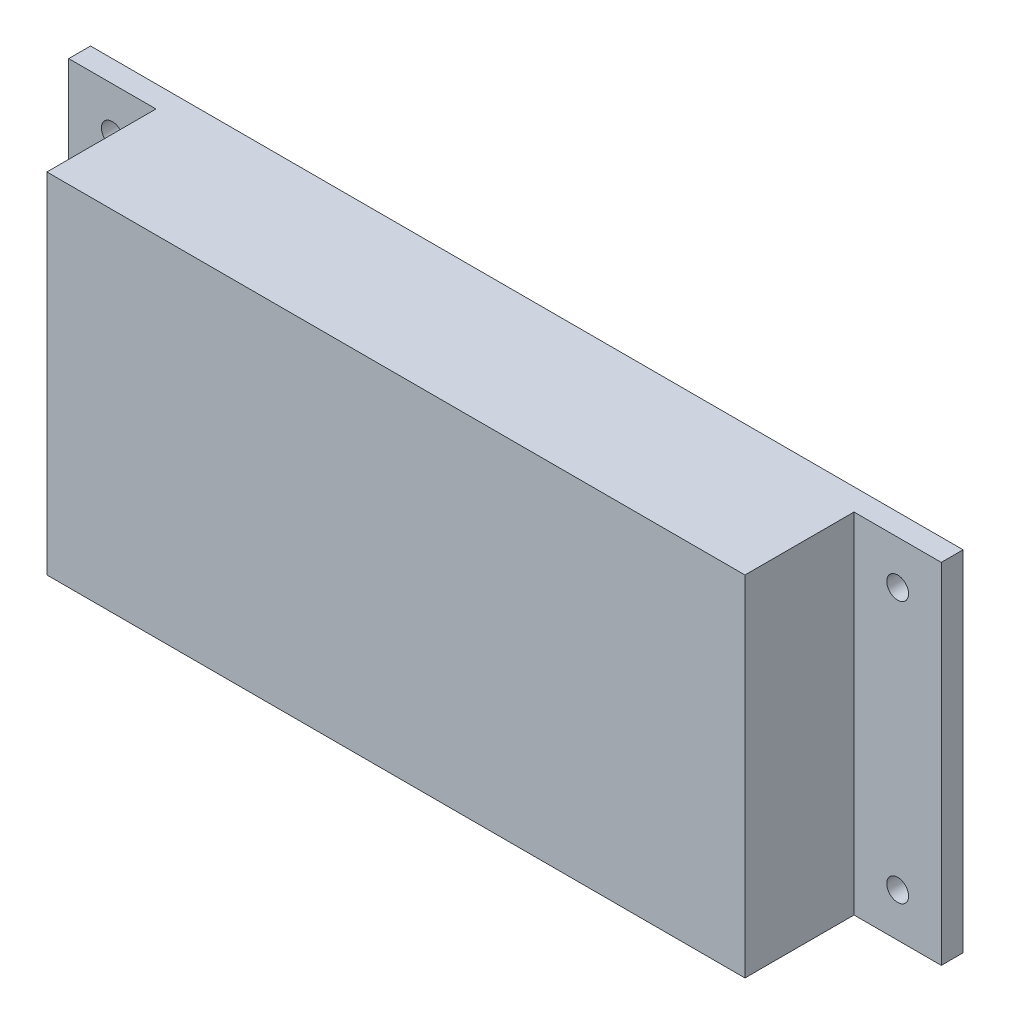
ISO-10303-21;
HEADER;
FILE_DESCRIPTION(('STEP AP214'),'2;1');
FILE_NAME('part.step','',(''),(''),'','','');
FILE_SCHEMA(('AUTOMOTIVE_DESIGN { 1 0 10303 214 1 1 1 1 }'));
ENDSEC;
DATA;
#1=APPLICATION_CONTEXT('core data for automotive mechanical design processes');
#2=APPLICATION_PROTOCOL_DEFINITION('international standard','automotive_design',2000,#1);
#3=PRODUCT_CONTEXT('',#1,'mechanical');
#4=PRODUCT('Part','Part','',(#3));
#5=PRODUCT_RELATED_PRODUCT_CATEGORY('part','',(#4));
#6=PRODUCT_DEFINITION_FORMATION('','',#4);
#7=PRODUCT_DEFINITION_CONTEXT('part definition',#1,'design');
#8=PRODUCT_DEFINITION('design','',#6,#7);
#9=PRODUCT_DEFINITION_SHAPE('','',#8);
#10=(LENGTH_UNIT() NAMED_UNIT(*) SI_UNIT(.MILLI.,.METRE.));
#11=(NAMED_UNIT(*) PLANE_ANGLE_UNIT() SI_UNIT($,.RADIAN.));
#12=(NAMED_UNIT(*) SI_UNIT($,.STERADIAN.) SOLID_ANGLE_UNIT());
#13=UNCERTAINTY_MEASURE_WITH_UNIT(LENGTH_MEASURE(1.E-05),#10,'distance_accuracy_value','');
#14=(GEOMETRIC_REPRESENTATION_CONTEXT(3) GLOBAL_UNCERTAINTY_ASSIGNED_CONTEXT((#13)) GLOBAL_UNIT_ASSIGNED_CONTEXT((#10,
#11,#12)) REPRESENTATION_CONTEXT('',''));
#15=CARTESIAN_POINT('',(0.,0.,0.));
#16=DIRECTION('',(0.,0.,1.));
#17=DIRECTION('',(1.,0.,0.));
#18=AXIS2_PLACEMENT_3D('',#15,#16,#17);
#19=CARTESIAN_POINT('',(0.,0.,5.));
#20=DIRECTION('',(0.,0.,-1.));
#21=DIRECTION('',(-1.,0.,0.));
#22=AXIS2_PLACEMENT_3D('',#19,#20,#21);
#23=PLANE('',#22);
#24=CARTESIAN_POINT('',(90.,30.,5.));
#25=DIRECTION('',(0.,0.,1.));
#26=DIRECTION('',(1.,0.,0.));
#27=AXIS2_PLACEMENT_3D('',#24,#25,#26);
#28=CIRCLE('',#27,2.49999999999999);
#29=CARTESIAN_POINT('',(92.5,30.,5.));
#30=VERTEX_POINT('',#29);
#31=EDGE_CURVE('E232',#30,#30,#28,.T.);
#32=ORIENTED_EDGE('',*,*,#31,.F.);
#33=EDGE_LOOP('',(#32));
#34=FACE_BOUND('',#33,.T.);
#35=CARTESIAN_POINT('',(90.,-30.,5.));
#36=DIRECTION('',(0.,0.,1.));
#37=DIRECTION('',(1.,0.,0.));
#38=AXIS2_PLACEMENT_3D('',#35,#36,#37);
#39=CIRCLE('',#38,2.49999999999999);
#40=CARTESIAN_POINT('',(92.5,-30.,5.));
#41=VERTEX_POINT('',#40);
#42=EDGE_CURVE('E231',#41,#41,#39,.T.);
#43=ORIENTED_EDGE('',*,*,#42,.F.);
#44=EDGE_LOOP('',(#43));
#45=FACE_BOUND('',#44,.T.);
#46=DIRECTION('',(0.,1.,0.));
#47=VECTOR('',#46,1.);
#48=CARTESIAN_POINT('',(80.,-40.,5.));
#49=LINE('',#48,#47);
#50=CARTESIAN_POINT('',(79.9999999999999,-40.,5.));
#51=VERTEX_POINT('',#50);
#52=CARTESIAN_POINT('',(79.9999999999999,40.,5.));
#53=VERTEX_POINT('',#52);
#54=EDGE_CURVE('E59',#51,#53,#49,.T.);
#55=ORIENTED_EDGE('',*,*,#54,.F.);
#56=DIRECTION('',(1.,0.,0.));
#57=VECTOR('',#56,1.);
#58=CARTESIAN_POINT('',(-100.,-40.,5.));
#59=LINE('',#58,#57);
#60=CARTESIAN_POINT('',(100.,-40.,5.));
#61=VERTEX_POINT('',#60);
#62=EDGE_CURVE('E211',#51,#61,#59,.T.);
#63=ORIENTED_EDGE('',*,*,#62,.T.);
#64=DIRECTION('',(0.,1.,0.));
#65=VECTOR('',#64,1.);
#66=CARTESIAN_POINT('',(100.,-40.,5.));
#67=LINE('',#66,#65);
#68=CARTESIAN_POINT('',(100.,40.,5.));
#69=VERTEX_POINT('',#68);
#70=EDGE_CURVE('E202',#61,#69,#67,.T.);
#71=ORIENTED_EDGE('',*,*,#70,.T.);
#72=DIRECTION('',(-1.,0.,0.));
#73=VECTOR('',#72,1.);
#74=CARTESIAN_POINT('',(-100.,40.,5.));
#75=LINE('',#74,#73);
#76=EDGE_CURVE('E207',#69,#53,#75,.T.);
#77=ORIENTED_EDGE('',*,*,#76,.T.);
#78=EDGE_LOOP('',(#55,#63,#71,#77));
#79=FACE_BOUND('',#78,.T.);
#80=ADVANCED_FACE('F42',(#34,#45,#79),#23,.F.);
#81=CARTESIAN_POINT('',(-90.,30.,5.));
#82=DIRECTION('',(0.,0.,1.));
#83=DIRECTION('',(1.,0.,0.));
#84=AXIS2_PLACEMENT_3D('',#81,#82,#83);
#85=CIRCLE('',#84,2.49999999999999);
#86=CARTESIAN_POINT('',(-87.5,30.,5.));
#87=VERTEX_POINT('',#86);
#88=EDGE_CURVE('E245',#87,#87,#85,.T.);
#89=ORIENTED_EDGE('',*,*,#88,.F.);
#90=EDGE_LOOP('',(#89));
#91=FACE_BOUND('',#90,.T.);
#92=CARTESIAN_POINT('',(-90.,-30.,5.));
#93=DIRECTION('',(0.,0.,1.));
#94=DIRECTION('',(1.,0.,0.));
#95=AXIS2_PLACEMENT_3D('',#92,#93,#94);
#96=CIRCLE('',#95,2.49999999999999);
#97=CARTESIAN_POINT('',(-87.5,-30.,5.));
#98=VERTEX_POINT('',#97);
#99=EDGE_CURVE('E235',#98,#98,#96,.T.);
#100=ORIENTED_EDGE('',*,*,#99,.F.);
#101=EDGE_LOOP('',(#100));
#102=FACE_BOUND('',#101,.T.);
#103=DIRECTION('',(0.,-1.,0.));
#104=VECTOR('',#103,1.);
#105=CARTESIAN_POINT('',(-80.,-40.,5.));
#106=LINE('',#105,#104);
#107=CARTESIAN_POINT('',(-80.,40.,5.));
#108=VERTEX_POINT('',#107);
#109=CARTESIAN_POINT('',(-80.,-40.,5.));
#110=VERTEX_POINT('',#109);
#111=EDGE_CURVE('E67',#108,#110,#106,.T.);
#112=ORIENTED_EDGE('',*,*,#111,.F.);
#113=CARTESIAN_POINT('',(-100.,40.,5.));
#114=VERTEX_POINT('',#113);
#115=EDGE_CURVE('E205',#108,#114,#75,.T.);
#116=ORIENTED_EDGE('',*,*,#115,.T.);
#117=DIRECTION('',(0.,-1.,0.));
#118=VECTOR('',#117,1.);
#119=CARTESIAN_POINT('',(-100.,-40.,5.));
#120=LINE('',#119,#118);
#121=CARTESIAN_POINT('',(-100.,-40.,5.));
#122=VERTEX_POINT('',#121);
#123=EDGE_CURVE('E209',#114,#122,#120,.T.);
#124=ORIENTED_EDGE('',*,*,#123,.T.);
#125=EDGE_CURVE('E212',#122,#110,#59,.T.);
#126=ORIENTED_EDGE('',*,*,#125,.T.);
#127=EDGE_LOOP('',(#112,#116,#124,#126));
#128=FACE_BOUND('',#127,.T.);
#129=ADVANCED_FACE('F282',(#91,#102,#128),#23,.F.);
#130=CARTESIAN_POINT('',(100.,-40.,5.));
#131=DIRECTION('',(-1.,0.,0.));
#132=DIRECTION('',(0.,0.,1.));
#133=AXIS2_PLACEMENT_3D('',#130,#131,#132);
#134=PLANE('',#133);
#135=DIRECTION('',(0.,1.,0.));
#136=VECTOR('',#135,1.);
#137=CARTESIAN_POINT('',(100.,-40.,0.));
#138=LINE('',#137,#136);
#139=CARTESIAN_POINT('',(100.,-40.,0.));
#140=VERTEX_POINT('',#139);
#141=CARTESIAN_POINT('',(100.,40.,0.));
#142=VERTEX_POINT('',#141);
#143=EDGE_CURVE('E201',#140,#142,#138,.T.);
#144=ORIENTED_EDGE('',*,*,#143,.T.);
#145=DIRECTION('',(0.,0.,-1.));
#146=VECTOR('',#145,1.);
#147=CARTESIAN_POINT('',(100.,40.,5.));
#148=LINE('',#147,#146);
#149=EDGE_CURVE('E11',#69,#142,#148,.T.);
#150=ORIENTED_EDGE('',*,*,#149,.F.);
#151=ORIENTED_EDGE('',*,*,#70,.F.);
#152=DIRECTION('',(0.,0.,-1.));
#153=VECTOR('',#152,1.);
#154=CARTESIAN_POINT('',(100.,-40.,5.));
#155=LINE('',#154,#153);
#156=EDGE_CURVE('E214',#61,#140,#155,.T.);
#157=ORIENTED_EDGE('',*,*,#156,.T.);
#158=EDGE_LOOP('',(#144,#150,#151,#157));
#159=FACE_BOUND('',#158,.T.);
#160=ADVANCED_FACE('F44',(#159),#134,.F.);
#161=CARTESIAN_POINT('',(-100.,40.,5.));
#162=DIRECTION('',(0.,-1.,0.));
#163=DIRECTION('',(0.,0.,-1.));
#164=AXIS2_PLACEMENT_3D('',#161,#162,#163);
#165=PLANE('',#164);
#166=DIRECTION('',(-1.,0.,0.));
#167=VECTOR('',#166,1.);
#168=CARTESIAN_POINT('',(-100.,40.,0.));
#169=LINE('',#168,#167);
#170=CARTESIAN_POINT('',(-100.,40.,0.));
#171=VERTEX_POINT('',#170);
#172=EDGE_CURVE('E217',#142,#171,#169,.T.);
#173=ORIENTED_EDGE('',*,*,#172,.T.);
#174=DIRECTION('',(0.,0.,-1.));
#175=VECTOR('',#174,1.);
#176=CARTESIAN_POINT('',(-100.,40.,5.));
#177=LINE('',#176,#175);
#178=EDGE_CURVE('E51',#114,#171,#177,.T.);
#179=ORIENTED_EDGE('',*,*,#178,.F.);
#180=ORIENTED_EDGE('',*,*,#115,.F.);
#181=DIRECTION('',(0.,0.,-1.));
#182=VECTOR('',#181,1.);
#183=CARTESIAN_POINT('',(-80.,40.,30.));
#184=LINE('',#183,#182);
#185=CARTESIAN_POINT('',(-80.,40.,30.));
#186=VERTEX_POINT('',#185);
#187=EDGE_CURVE('E195',#186,#108,#184,.T.);
#188=ORIENTED_EDGE('',*,*,#187,.F.);
#189=DIRECTION('',(-1.,0.,0.));
#190=VECTOR('',#189,1.);
#191=CARTESIAN_POINT('',(-80.,40.,30.));
#192=LINE('',#191,#190);
#193=CARTESIAN_POINT('',(80.,40.,30.));
#194=VERTEX_POINT('',#193);
#195=EDGE_CURVE('E181',#194,#186,#192,.T.);
#196=ORIENTED_EDGE('',*,*,#195,.F.);
#197=DIRECTION('',(0.,0.,-1.));
#198=VECTOR('',#197,1.);
#199=CARTESIAN_POINT('',(80.,40.,30.));
#200=LINE('',#199,#198);
#201=EDGE_CURVE('E198',#194,#53,#200,.T.);
#202=ORIENTED_EDGE('',*,*,#201,.T.);
#203=ORIENTED_EDGE('',*,*,#76,.F.);
#204=ORIENTED_EDGE('',*,*,#149,.T.);
#205=EDGE_LOOP('',(#173,#179,#180,#188,#196,#202,#203,#204));
#206=FACE_BOUND('',#205,.T.);
#207=ADVANCED_FACE('F278',(#206),#165,.F.);
#208=CARTESIAN_POINT('',(-100.,-40.,5.));
#209=DIRECTION('',(1.,0.,0.));
#210=DIRECTION('',(0.,0.,-1.));
#211=AXIS2_PLACEMENT_3D('',#208,#209,#210);
#212=PLANE('',#211);
#213=DIRECTION('',(0.,-1.,0.));
#214=VECTOR('',#213,1.);
#215=CARTESIAN_POINT('',(-100.,-40.,0.));
#216=LINE('',#215,#214);
#217=CARTESIAN_POINT('',(-100.,-40.,0.));
#218=VERTEX_POINT('',#217);
#219=EDGE_CURVE('E219',#171,#218,#216,.T.);
#220=ORIENTED_EDGE('',*,*,#219,.T.);
#221=DIRECTION('',(0.,0.,-1.));
#222=VECTOR('',#221,1.);
#223=CARTESIAN_POINT('',(-100.,-40.,5.));
#224=LINE('',#223,#222);
#225=EDGE_CURVE('E224',#122,#218,#224,.T.);
#226=ORIENTED_EDGE('',*,*,#225,.F.);
#227=ORIENTED_EDGE('',*,*,#123,.F.);
#228=ORIENTED_EDGE('',*,*,#178,.T.);
#229=EDGE_LOOP('',(#220,#226,#227,#228));
#230=FACE_BOUND('',#229,.T.);
#231=ADVANCED_FACE('F275',(#230),#212,.F.);
#232=CARTESIAN_POINT('',(-100.,-40.,5.));
#233=DIRECTION('',(0.,1.,0.));
#234=DIRECTION('',(0.,0.,1.));
#235=AXIS2_PLACEMENT_3D('',#232,#233,#234);
#236=PLANE('',#235);
#237=DIRECTION('',(1.,0.,0.));
#238=VECTOR('',#237,1.);
#239=CARTESIAN_POINT('',(-100.,-40.,0.));
#240=LINE('',#239,#238);
#241=EDGE_CURVE('E206',#218,#140,#240,.T.);
#242=ORIENTED_EDGE('',*,*,#241,.T.);
#243=ORIENTED_EDGE('',*,*,#156,.F.);
#244=ORIENTED_EDGE('',*,*,#62,.F.);
#245=DIRECTION('',(0.,0.,-1.));
#246=VECTOR('',#245,1.);
#247=CARTESIAN_POINT('',(80.,-40.,30.));
#248=LINE('',#247,#246);
#249=CARTESIAN_POINT('',(80.,-40.,30.));
#250=VERTEX_POINT('',#249);
#251=EDGE_CURVE('E187',#250,#51,#248,.T.);
#252=ORIENTED_EDGE('',*,*,#251,.F.);
#253=DIRECTION('',(1.,0.,0.));
#254=VECTOR('',#253,1.);
#255=CARTESIAN_POINT('',(-80.,-40.,30.));
#256=LINE('',#255,#254);
#257=CARTESIAN_POINT('',(-80.,-40.,30.));
#258=VERTEX_POINT('',#257);
#259=EDGE_CURVE('E185',#258,#250,#256,.T.);
#260=ORIENTED_EDGE('',*,*,#259,.F.);
#261=DIRECTION('',(0.,0.,-1.));
#262=VECTOR('',#261,1.);
#263=CARTESIAN_POINT('',(-80.,-40.,30.));
#264=LINE('',#263,#262);
#265=EDGE_CURVE('E192',#258,#110,#264,.T.);
#266=ORIENTED_EDGE('',*,*,#265,.T.);
#267=ORIENTED_EDGE('',*,*,#125,.F.);
#268=ORIENTED_EDGE('',*,*,#225,.T.);
#269=EDGE_LOOP('',(#242,#243,#244,#252,#260,#266,#267,#268));
#270=FACE_BOUND('',#269,.T.);
#271=ADVANCED_FACE('F259',(#270),#236,.F.);
#272=CARTESIAN_POINT('',(0.,0.,0.));
#273=DIRECTION('',(0.,0.,-1.));
#274=DIRECTION('',(-1.,0.,0.));
#275=AXIS2_PLACEMENT_3D('',#272,#273,#274);
#276=PLANE('',#275);
#277=CARTESIAN_POINT('',(-90.,30.,0.));
#278=DIRECTION('',(0.,0.,-1.));
#279=DIRECTION('',(-1.,0.,0.));
#280=AXIS2_PLACEMENT_3D('',#277,#278,#279);
#281=CIRCLE('',#280,2.49999999999999);
#282=CARTESIAN_POINT('',(-92.5,30.,0.));
#283=VERTEX_POINT('',#282);
#284=EDGE_CURVE('E46',#283,#283,#281,.T.);
#285=ORIENTED_EDGE('',*,*,#284,.F.);
#286=EDGE_LOOP('',(#285));
#287=FACE_BOUND('',#286,.T.);
#288=CARTESIAN_POINT('',(-90.,-30.,0.));
#289=DIRECTION('',(0.,0.,-1.));
#290=DIRECTION('',(-1.,0.,0.));
#291=AXIS2_PLACEMENT_3D('',#288,#289,#290);
#292=CIRCLE('',#291,2.49999999999999);
#293=CARTESIAN_POINT('',(-92.5,-30.,0.));
#294=VERTEX_POINT('',#293);
#295=EDGE_CURVE('E233',#294,#294,#292,.T.);
#296=ORIENTED_EDGE('',*,*,#295,.F.);
#297=EDGE_LOOP('',(#296));
#298=FACE_BOUND('',#297,.T.);
#299=CARTESIAN_POINT('',(90.,30.,0.));
#300=DIRECTION('',(0.,0.,-1.));
#301=DIRECTION('',(-1.,0.,0.));
#302=AXIS2_PLACEMENT_3D('',#299,#300,#301);
#303=CIRCLE('',#302,2.49999999999999);
#304=CARTESIAN_POINT('',(87.5,30.,0.));
#305=VERTEX_POINT('',#304);
#306=EDGE_CURVE('E229',#305,#305,#303,.T.);
#307=ORIENTED_EDGE('',*,*,#306,.F.);
#308=EDGE_LOOP('',(#307));
#309=FACE_BOUND('',#308,.T.);
#310=CARTESIAN_POINT('',(90.,-30.,0.));
#311=DIRECTION('',(0.,0.,-1.));
#312=DIRECTION('',(-1.,0.,0.));
#313=AXIS2_PLACEMENT_3D('',#310,#311,#312);
#314=CIRCLE('',#313,2.49999999999999);
#315=CARTESIAN_POINT('',(87.5,-30.,0.));
#316=VERTEX_POINT('',#315);
#317=EDGE_CURVE('E163',#316,#316,#314,.T.);
#318=ORIENTED_EDGE('',*,*,#317,.F.);
#319=EDGE_LOOP('',(#318));
#320=FACE_BOUND('',#319,.T.);
#321=ORIENTED_EDGE('',*,*,#143,.F.);
#322=ORIENTED_EDGE('',*,*,#241,.F.);
#323=ORIENTED_EDGE('',*,*,#219,.F.);
#324=ORIENTED_EDGE('',*,*,#172,.F.);
#325=EDGE_LOOP('',(#321,#322,#323,#324));
#326=FACE_BOUND('',#325,.T.);
#327=ADVANCED_FACE('F255',(#287,#298,#309,#320,#326),#276,.T.);
#328=CARTESIAN_POINT('',(80.,-40.,30.));
#329=DIRECTION('',(-1.,0.,0.));
#330=DIRECTION('',(0.,0.,1.));
#331=AXIS2_PLACEMENT_3D('',#328,#329,#330);
#332=PLANE('',#331);
#333=ORIENTED_EDGE('',*,*,#54,.T.);
#334=ORIENTED_EDGE('',*,*,#201,.F.);
#335=DIRECTION('',(0.,1.,0.));
#336=VECTOR('',#335,1.);
#337=CARTESIAN_POINT('',(80.,-40.,30.));
#338=LINE('',#337,#336);
#339=EDGE_CURVE('E178',#250,#194,#338,.T.);
#340=ORIENTED_EDGE('',*,*,#339,.F.);
#341=ORIENTED_EDGE('',*,*,#251,.T.);
#342=EDGE_LOOP('',(#333,#334,#340,#341));
#343=FACE_BOUND('',#342,.T.);
#344=ADVANCED_FACE('F258',(#343),#332,.F.);
#345=CARTESIAN_POINT('',(-80.,-40.,30.));
#346=DIRECTION('',(1.,0.,0.));
#347=DIRECTION('',(0.,0.,-1.));
#348=AXIS2_PLACEMENT_3D('',#345,#346,#347);
#349=PLANE('',#348);
#350=ORIENTED_EDGE('',*,*,#111,.T.);
#351=ORIENTED_EDGE('',*,*,#265,.F.);
#352=DIRECTION('',(0.,-1.,0.));
#353=VECTOR('',#352,1.);
#354=CARTESIAN_POINT('',(-80.,-40.,30.));
#355=LINE('',#354,#353);
#356=EDGE_CURVE('E183',#186,#258,#355,.T.);
#357=ORIENTED_EDGE('',*,*,#356,.F.);
#358=ORIENTED_EDGE('',*,*,#187,.T.);
#359=EDGE_LOOP('',(#350,#351,#357,#358));
#360=FACE_BOUND('',#359,.T.);
#361=ADVANCED_FACE('F348',(#360),#349,.F.);
#362=CARTESIAN_POINT('',(0.,0.,30.));
#363=DIRECTION('',(0.,0.,-1.));
#364=DIRECTION('',(-1.,0.,0.));
#365=AXIS2_PLACEMENT_3D('',#362,#363,#364);
#366=PLANE('',#365);
#367=ORIENTED_EDGE('',*,*,#339,.T.);
#368=ORIENTED_EDGE('',*,*,#195,.T.);
#369=ORIENTED_EDGE('',*,*,#356,.T.);
#370=ORIENTED_EDGE('',*,*,#259,.T.);
#371=EDGE_LOOP('',(#367,#368,#369,#370));
#372=FACE_BOUND('',#371,.T.);
#373=ADVANCED_FACE('F356',(#372),#366,.F.);
#374=CARTESIAN_POINT('',(90.,-30.,5.));
#375=DIRECTION('',(0.,0.,1.));
#376=DIRECTION('',(1.,0.,0.));
#377=AXIS2_PLACEMENT_3D('',#374,#375,#376);
#378=CYLINDRICAL_SURFACE('',#377,2.49999999999999);
#379=ORIENTED_EDGE('',*,*,#317,.T.);
#380=EDGE_LOOP('',(#379));
#381=FACE_BOUND('',#380,.T.);
#382=ORIENTED_EDGE('',*,*,#42,.T.);
#383=EDGE_LOOP('',(#382));
#384=FACE_BOUND('',#383,.T.);
#385=ADVANCED_FACE('F253',(#381,#384),#378,.F.);
#386=CARTESIAN_POINT('',(90.,30.,5.));
#387=DIRECTION('',(0.,0.,1.));
#388=DIRECTION('',(1.,0.,0.));
#389=AXIS2_PLACEMENT_3D('',#386,#387,#388);
#390=CYLINDRICAL_SURFACE('',#389,2.49999999999999);
#391=ORIENTED_EDGE('',*,*,#306,.T.);
#392=EDGE_LOOP('',(#391));
#393=FACE_BOUND('',#392,.T.);
#394=ORIENTED_EDGE('',*,*,#31,.T.);
#395=EDGE_LOOP('',(#394));
#396=FACE_BOUND('',#395,.T.);
#397=ADVANCED_FACE('F420',(#393,#396),#390,.F.);
#398=CARTESIAN_POINT('',(-90.,-30.,5.));
#399=DIRECTION('',(0.,0.,1.));
#400=DIRECTION('',(1.,0.,0.));
#401=AXIS2_PLACEMENT_3D('',#398,#399,#400);
#402=CYLINDRICAL_SURFACE('',#401,2.49999999999999);
#403=ORIENTED_EDGE('',*,*,#295,.T.);
#404=EDGE_LOOP('',(#403));
#405=FACE_BOUND('',#404,.T.);
#406=ORIENTED_EDGE('',*,*,#99,.T.);
#407=EDGE_LOOP('',(#406));
#408=FACE_BOUND('',#407,.T.);
#409=ADVANCED_FACE('F428',(#405,#408),#402,.F.);
#410=CARTESIAN_POINT('',(-90.,30.,5.));
#411=DIRECTION('',(0.,0.,1.));
#412=DIRECTION('',(1.,0.,0.));
#413=AXIS2_PLACEMENT_3D('',#410,#411,#412);
#414=CYLINDRICAL_SURFACE('',#413,2.49999999999999);
#415=ORIENTED_EDGE('',*,*,#284,.T.);
#416=EDGE_LOOP('',(#415));
#417=FACE_BOUND('',#416,.T.);
#418=ORIENTED_EDGE('',*,*,#88,.T.);
#419=EDGE_LOOP('',(#418));
#420=FACE_BOUND('',#419,.T.);
#421=ADVANCED_FACE('F438',(#417,#420),#414,.F.);
#422=CLOSED_SHELL('',(#80,#129,#160,#207,#231,#271,#327,#344,#361,#373,#385,#397,#409,#421));
#423=CARTESIAN_POINT('',(75.,-32.5,5.));
#424=DIRECTION('',(1.,0.,0.));
#425=DIRECTION('',(0.,0.,-1.));
#426=AXIS2_PLACEMENT_3D('',#423,#424,#425);
#427=PLANE('',#426);
#428=DIRECTION('',(0.,1.,0.));
#429=VECTOR('',#428,1.);
#430=CARTESIAN_POINT('',(75.,-32.5,25.));
#431=LINE('',#430,#429);
#432=CARTESIAN_POINT('',(75.,-32.5,25.));
#433=VERTEX_POINT('',#432);
#434=CARTESIAN_POINT('',(75.,32.5,25.));
#435=VERTEX_POINT('',#434);
#436=EDGE_CURVE('E140',#433,#435,#431,.T.);
#437=ORIENTED_EDGE('',*,*,#436,.T.);
#438=DIRECTION('',(0.,0.,1.));
#439=VECTOR('',#438,1.);
#440=CARTESIAN_POINT('',(75.,32.5,5.));
#441=LINE('',#440,#439);
#442=CARTESIAN_POINT('',(75.,32.5,5.));
#443=VERTEX_POINT('',#442);
#444=EDGE_CURVE('E133',#443,#435,#441,.T.);
#445=ORIENTED_EDGE('',*,*,#444,.F.);
#446=DIRECTION('',(0.,1.,0.));
#447=VECTOR('',#446,1.);
#448=CARTESIAN_POINT('',(75.,-32.5,5.));
#449=LINE('',#448,#447);
#450=CARTESIAN_POINT('',(75.,-32.5,5.));
#451=VERTEX_POINT('',#450);
#452=EDGE_CURVE('E137',#451,#443,#449,.T.);
#453=ORIENTED_EDGE('',*,*,#452,.F.);
#454=DIRECTION('',(0.,0.,1.));
#455=VECTOR('',#454,1.);
#456=CARTESIAN_POINT('',(75.,-32.5,5.));
#457=LINE('',#456,#455);
#458=EDGE_CURVE('E173',#451,#433,#457,.T.);
#459=ORIENTED_EDGE('',*,*,#458,.T.);
#460=EDGE_LOOP('',(#437,#445,#453,#459));
#461=FACE_BOUND('',#460,.T.);
#462=ADVANCED_FACE('F135',(#461),#427,.F.);
#463=CARTESIAN_POINT('',(-75.,-32.5,5.));
#464=DIRECTION('',(0.,-1.,0.));
#465=DIRECTION('',(0.,0.,-1.));
#466=AXIS2_PLACEMENT_3D('',#463,#464,#465);
#467=PLANE('',#466);
#468=DIRECTION('',(1.,0.,0.));
#469=VECTOR('',#468,1.);
#470=CARTESIAN_POINT('',(-75.,-32.5,25.));
#471=LINE('',#470,#469);
#472=CARTESIAN_POINT('',(-75.,-32.5,25.));
#473=VERTEX_POINT('',#472);
#474=EDGE_CURVE('E157',#473,#433,#471,.T.);
#475=ORIENTED_EDGE('',*,*,#474,.T.);
#476=ORIENTED_EDGE('',*,*,#458,.F.);
#477=DIRECTION('',(1.,0.,0.));
#478=VECTOR('',#477,1.);
#479=CARTESIAN_POINT('',(-75.,-32.5,5.));
#480=LINE('',#479,#478);
#481=CARTESIAN_POINT('',(-75.,-32.5,5.));
#482=VERTEX_POINT('',#481);
#483=EDGE_CURVE('E145',#482,#451,#480,.T.);
#484=ORIENTED_EDGE('',*,*,#483,.F.);
#485=DIRECTION('',(0.,0.,1.));
#486=VECTOR('',#485,1.);
#487=CARTESIAN_POINT('',(-75.,-32.5,5.));
#488=LINE('',#487,#486);
#489=EDGE_CURVE('E175',#482,#473,#488,.T.);
#490=ORIENTED_EDGE('',*,*,#489,.T.);
#491=EDGE_LOOP('',(#475,#476,#484,#490));
#492=FACE_BOUND('',#491,.T.);
#493=ADVANCED_FACE('F372',(#492),#467,.F.);
#494=CARTESIAN_POINT('',(-75.,-32.5,5.));
#495=DIRECTION('',(-1.,0.,0.));
#496=DIRECTION('',(0.,0.,1.));
#497=AXIS2_PLACEMENT_3D('',#494,#495,#496);
#498=PLANE('',#497);
#499=DIRECTION('',(0.,-1.,0.));
#500=VECTOR('',#499,1.);
#501=CARTESIAN_POINT('',(-75.,-32.5,25.));
#502=LINE('',#501,#500);
#503=CARTESIAN_POINT('',(-75.,32.5,25.));
#504=VERTEX_POINT('',#503);
#505=EDGE_CURVE('E160',#504,#473,#502,.T.);
#506=ORIENTED_EDGE('',*,*,#505,.T.);
#507=ORIENTED_EDGE('',*,*,#489,.F.);
#508=DIRECTION('',(0.,-1.,0.));
#509=VECTOR('',#508,1.);
#510=CARTESIAN_POINT('',(-75.,-32.5,5.));
#511=LINE('',#510,#509);
#512=CARTESIAN_POINT('',(-75.,32.5,5.));
#513=VERTEX_POINT('',#512);
#514=EDGE_CURVE('E153',#513,#482,#511,.T.);
#515=ORIENTED_EDGE('',*,*,#514,.F.);
#516=DIRECTION('',(0.,0.,1.));
#517=VECTOR('',#516,1.);
#518=CARTESIAN_POINT('',(-75.,32.5,5.));
#519=LINE('',#518,#517);
#520=EDGE_CURVE('E144',#513,#504,#519,.T.);
#521=ORIENTED_EDGE('',*,*,#520,.T.);
#522=EDGE_LOOP('',(#506,#507,#515,#521));
#523=FACE_BOUND('',#522,.T.);
#524=ADVANCED_FACE('F381',(#523),#498,.F.);
#525=CARTESIAN_POINT('',(-75.,32.5,5.));
#526=DIRECTION('',(0.,1.,0.));
#527=DIRECTION('',(0.,0.,1.));
#528=AXIS2_PLACEMENT_3D('',#525,#526,#527);
#529=PLANE('',#528);
#530=DIRECTION('',(-1.,0.,0.));
#531=VECTOR('',#530,1.);
#532=CARTESIAN_POINT('',(-75.,32.5,25.));
#533=LINE('',#532,#531);
#534=EDGE_CURVE('E169',#435,#504,#533,.T.);
#535=ORIENTED_EDGE('',*,*,#534,.T.);
#536=ORIENTED_EDGE('',*,*,#520,.F.);
#537=DIRECTION('',(-1.,0.,0.));
#538=VECTOR('',#537,1.);
#539=CARTESIAN_POINT('',(-75.,32.5,5.));
#540=LINE('',#539,#538);
#541=EDGE_CURVE('E148',#443,#513,#540,.T.);
#542=ORIENTED_EDGE('',*,*,#541,.F.);
#543=ORIENTED_EDGE('',*,*,#444,.T.);
#544=EDGE_LOOP('',(#535,#536,#542,#543));
#545=FACE_BOUND('',#544,.T.);
#546=ADVANCED_FACE('F149',(#545),#529,.F.);
#547=CARTESIAN_POINT('',(0.,0.,5.));
#548=DIRECTION('',(0.,0.,-1.));
#549=DIRECTION('',(-1.,0.,0.));
#550=AXIS2_PLACEMENT_3D('',#547,#548,#549);
#551=PLANE('',#550);
#552=ORIENTED_EDGE('',*,*,#452,.T.);
#553=ORIENTED_EDGE('',*,*,#541,.T.);
#554=ORIENTED_EDGE('',*,*,#514,.T.);
#555=ORIENTED_EDGE('',*,*,#483,.T.);
#556=EDGE_LOOP('',(#552,#553,#554,#555));
#557=FACE_BOUND('',#556,.T.);
#558=ADVANCED_FACE('F155',(#557),#551,.F.);
#559=CARTESIAN_POINT('',(0.,0.,25.));
#560=DIRECTION('',(0.,0.,-1.));
#561=DIRECTION('',(-1.,0.,0.));
#562=AXIS2_PLACEMENT_3D('',#559,#560,#561);
#563=PLANE('',#562);
#564=ORIENTED_EDGE('',*,*,#436,.F.);
#565=ORIENTED_EDGE('',*,*,#474,.F.);
#566=ORIENTED_EDGE('',*,*,#505,.F.);
#567=ORIENTED_EDGE('',*,*,#534,.F.);
#568=EDGE_LOOP('',(#564,#565,#566,#567));
#569=FACE_BOUND('',#568,.T.);
#570=ADVANCED_FACE('F405',(#569),#563,.T.);
#571=CLOSED_SHELL('',(#462,#493,#524,#546,#558,#570));
#572=ORIENTED_CLOSED_SHELL('',*,#571,.T.);
#573=BREP_WITH_VOIDS('B2',#422,(#572));
#574=ADVANCED_BREP_SHAPE_REPRESENTATION('',(#18,#573),#14);
#575=SHAPE_DEFINITION_REPRESENTATION(#9,#574);
ENDSEC;
END-ISO-10303-21;
